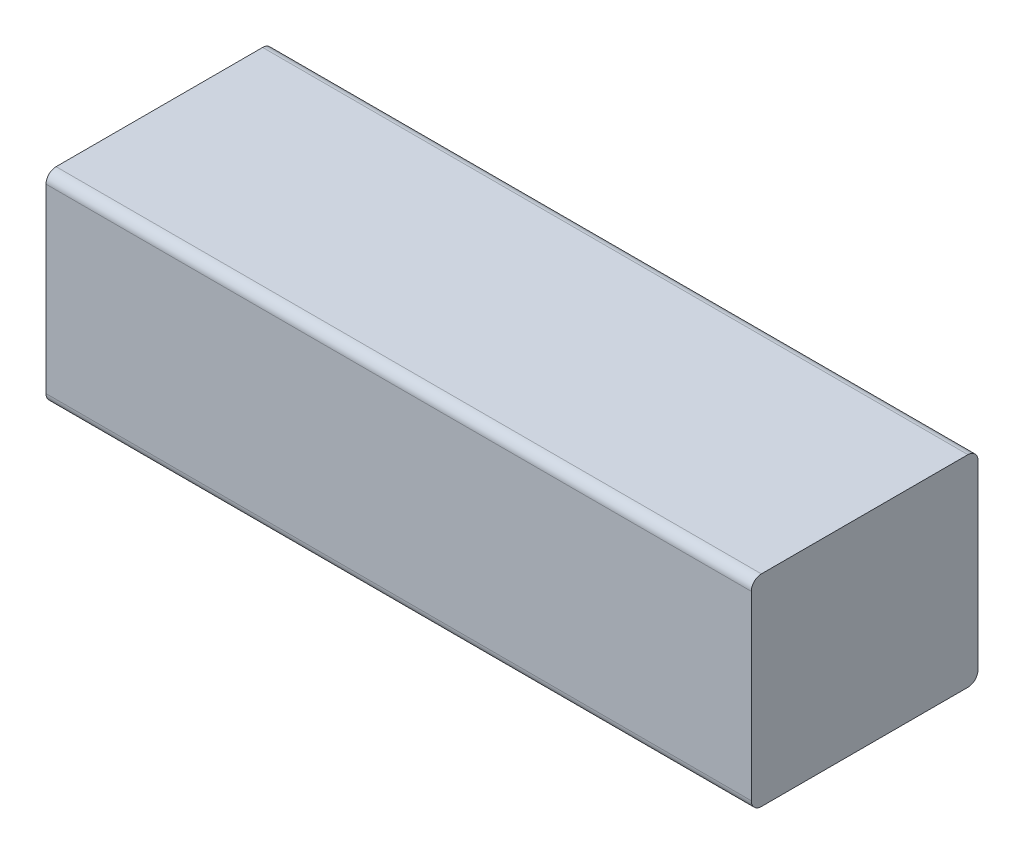
ISO-10303-21;
HEADER;
FILE_DESCRIPTION(('STEP AP214'),'2;1');
FILE_NAME('part.step','',(''),(''),'','','');
FILE_SCHEMA(('AUTOMOTIVE_DESIGN { 1 0 10303 214 1 1 1 1 }'));
ENDSEC;
DATA;
#1=APPLICATION_CONTEXT('core data for automotive mechanical design processes');
#2=APPLICATION_PROTOCOL_DEFINITION('international standard','automotive_design',2000,#1);
#3=PRODUCT_CONTEXT('',#1,'mechanical');
#4=PRODUCT('Part','Part','',(#3));
#5=PRODUCT_RELATED_PRODUCT_CATEGORY('part','',(#4));
#6=PRODUCT_DEFINITION_FORMATION('','',#4);
#7=PRODUCT_DEFINITION_CONTEXT('part definition',#1,'design');
#8=PRODUCT_DEFINITION('design','',#6,#7);
#9=PRODUCT_DEFINITION_SHAPE('','',#8);
#10=(LENGTH_UNIT() NAMED_UNIT(*) SI_UNIT(.MILLI.,.METRE.));
#11=(NAMED_UNIT(*) PLANE_ANGLE_UNIT() SI_UNIT($,.RADIAN.));
#12=(NAMED_UNIT(*) SI_UNIT($,.STERADIAN.) SOLID_ANGLE_UNIT());
#13=UNCERTAINTY_MEASURE_WITH_UNIT(LENGTH_MEASURE(1.E-05),#10,'distance_accuracy_value','');
#14=(GEOMETRIC_REPRESENTATION_CONTEXT(3) GLOBAL_UNCERTAINTY_ASSIGNED_CONTEXT((#13)) GLOBAL_UNIT_ASSIGNED_CONTEXT((#10,
#11,#12)) REPRESENTATION_CONTEXT('',''));
#15=CARTESIAN_POINT('',(0.,0.,0.));
#16=DIRECTION('',(0.,0.,1.));
#17=DIRECTION('',(1.,0.,0.));
#18=AXIS2_PLACEMENT_3D('',#15,#16,#17);
#19=CARTESIAN_POINT('',(0.,40.,-45.));
#20=DIRECTION('',(1.,0.,0.));
#21=DIRECTION('',(0.,0.,-1.));
#22=AXIS2_PLACEMENT_3D('',#19,#20,#21);
#23=PLANE('',#22);
#24=DIRECTION('',(0.,-1.,0.));
#25=VECTOR('',#24,1.);
#26=CARTESIAN_POINT('',(0.,40.,-45.));
#27=LINE('',#26,#25);
#28=CARTESIAN_POINT('',(0.,38.,-45.));
#29=VERTEX_POINT('',#28);
#30=CARTESIAN_POINT('',(0.,2.,-45.));
#31=VERTEX_POINT('',#30);
#32=EDGE_CURVE('E106',#29,#31,#27,.T.);
#33=ORIENTED_EDGE('',*,*,#32,.T.);
#34=CARTESIAN_POINT('',(0.,2.,-43.));
#35=DIRECTION('',(1.,0.,0.));
#36=DIRECTION('',(0.,0.,-1.));
#37=AXIS2_PLACEMENT_3D('',#34,#35,#36);
#38=CIRCLE('',#37,2.);
#39=CARTESIAN_POINT('',(0.,0.,-43.));
#40=VERTEX_POINT('',#39);
#41=EDGE_CURVE('E139',#31,#40,#38,.F.);
#42=ORIENTED_EDGE('',*,*,#41,.T.);
#43=DIRECTION('',(0.,0.,1.));
#44=VECTOR('',#43,1.);
#45=CARTESIAN_POINT('',(0.,0.,-45.));
#46=LINE('',#45,#44);
#47=CARTESIAN_POINT('',(0.,0.,-2.00000000000002));
#48=VERTEX_POINT('',#47);
#49=EDGE_CURVE('E166',#40,#48,#46,.T.);
#50=ORIENTED_EDGE('',*,*,#49,.T.);
#51=CARTESIAN_POINT('',(0.,2.,-2.));
#52=DIRECTION('',(1.,0.,0.));
#53=DIRECTION('',(0.,0.,-1.));
#54=AXIS2_PLACEMENT_3D('',#51,#52,#53);
#55=CIRCLE('',#54,2.);
#56=CARTESIAN_POINT('',(0.,2.,0.));
#57=VERTEX_POINT('',#56);
#58=EDGE_CURVE('E112',#48,#57,#55,.F.);
#59=ORIENTED_EDGE('',*,*,#58,.T.);
#60=DIRECTION('',(0.,-1.,0.));
#61=VECTOR('',#60,1.);
#62=CARTESIAN_POINT('',(0.,40.,0.));
#63=LINE('',#62,#61);
#64=CARTESIAN_POINT('',(0.,38.,0.));
#65=VERTEX_POINT('',#64);
#66=EDGE_CURVE('E129',#65,#57,#63,.T.);
#67=ORIENTED_EDGE('',*,*,#66,.F.);
#68=CARTESIAN_POINT('',(0.,38.,-2.));
#69=DIRECTION('',(1.,0.,0.));
#70=DIRECTION('',(0.,0.,-1.));
#71=AXIS2_PLACEMENT_3D('',#68,#69,#70);
#72=CIRCLE('',#71,2.);
#73=CARTESIAN_POINT('',(0.,40.,-2.00000000000002));
#74=VERTEX_POINT('',#73);
#75=EDGE_CURVE('E113',#65,#74,#72,.F.);
#76=ORIENTED_EDGE('',*,*,#75,.T.);
#77=DIRECTION('',(0.,0.,1.));
#78=VECTOR('',#77,1.);
#79=CARTESIAN_POINT('',(0.,40.,-45.));
#80=LINE('',#79,#78);
#81=CARTESIAN_POINT('',(0.,40.,-43.));
#82=VERTEX_POINT('',#81);
#83=EDGE_CURVE('E108',#82,#74,#80,.T.);
#84=ORIENTED_EDGE('',*,*,#83,.F.);
#85=CARTESIAN_POINT('',(0.,38.,-43.));
#86=DIRECTION('',(1.,0.,0.));
#87=DIRECTION('',(0.,0.,-1.));
#88=AXIS2_PLACEMENT_3D('',#85,#86,#87);
#89=CIRCLE('',#88,2.);
#90=EDGE_CURVE('E104',#82,#29,#89,.F.);
#91=ORIENTED_EDGE('',*,*,#90,.T.);
#92=EDGE_LOOP('',(#33,#42,#50,#59,#67,#76,#84,#91));
#93=FACE_BOUND('',#92,.T.);
#94=ADVANCED_FACE('F37',(#93),#23,.F.);
#95=CARTESIAN_POINT('',(0.,40.,0.));
#96=DIRECTION('',(0.,0.,-1.));
#97=DIRECTION('',(-1.,0.,0.));
#98=AXIS2_PLACEMENT_3D('',#95,#96,#97);
#99=PLANE('',#98);
#100=ORIENTED_EDGE('',*,*,#66,.T.);
#101=DIRECTION('',(1.,0.,0.));
#102=VECTOR('',#101,1.);
#103=CARTESIAN_POINT('',(0.,2.,0.));
#104=LINE('',#103,#102);
#105=CARTESIAN_POINT('',(140.,2.,0.));
#106=VERTEX_POINT('',#105);
#107=EDGE_CURVE('E152',#57,#106,#104,.T.);
#108=ORIENTED_EDGE('',*,*,#107,.T.);
#109=DIRECTION('',(0.,-1.,0.));
#110=VECTOR('',#109,1.);
#111=CARTESIAN_POINT('',(140.,40.,0.));
#112=LINE('',#111,#110);
#113=CARTESIAN_POINT('',(140.,38.,0.));
#114=VERTEX_POINT('',#113);
#115=EDGE_CURVE('E133',#114,#106,#112,.T.);
#116=ORIENTED_EDGE('',*,*,#115,.F.);
#117=DIRECTION('',(1.,0.,0.));
#118=VECTOR('',#117,1.);
#119=CARTESIAN_POINT('',(0.,38.,0.));
#120=LINE('',#119,#118);
#121=EDGE_CURVE('E150',#114,#65,#120,.F.);
#122=ORIENTED_EDGE('',*,*,#121,.T.);
#123=EDGE_LOOP('',(#100,#108,#116,#122));
#124=FACE_BOUND('',#123,.T.);
#125=ADVANCED_FACE('F173',(#124),#99,.F.);
#126=CARTESIAN_POINT('',(140.,40.,0.));
#127=DIRECTION('',(-1.,0.,0.));
#128=DIRECTION('',(0.,0.,1.));
#129=AXIS2_PLACEMENT_3D('',#126,#127,#128);
#130=PLANE('',#129);
#131=DIRECTION('',(0.,0.,-1.));
#132=VECTOR('',#131,1.);
#133=CARTESIAN_POINT('',(140.,0.,0.));
#134=LINE('',#133,#132);
#135=CARTESIAN_POINT('',(140.,0.,-2.));
#136=VERTEX_POINT('',#135);
#137=CARTESIAN_POINT('',(140.,0.,-43.));
#138=VERTEX_POINT('',#137);
#139=EDGE_CURVE('E163',#136,#138,#134,.T.);
#140=ORIENTED_EDGE('',*,*,#139,.T.);
#141=CARTESIAN_POINT('',(140.,2.,-43.));
#142=DIRECTION('',(-1.,0.,0.));
#143=DIRECTION('',(0.,0.,1.));
#144=AXIS2_PLACEMENT_3D('',#141,#142,#143);
#145=CIRCLE('',#144,2.);
#146=CARTESIAN_POINT('',(140.,2.,-45.));
#147=VERTEX_POINT('',#146);
#148=EDGE_CURVE('E148',#138,#147,#145,.F.);
#149=ORIENTED_EDGE('',*,*,#148,.T.);
#150=DIRECTION('',(0.,-1.,0.));
#151=VECTOR('',#150,1.);
#152=CARTESIAN_POINT('',(140.,40.,-45.));
#153=LINE('',#152,#151);
#154=CARTESIAN_POINT('',(140.,38.,-45.));
#155=VERTEX_POINT('',#154);
#156=EDGE_CURVE('E123',#155,#147,#153,.T.);
#157=ORIENTED_EDGE('',*,*,#156,.F.);
#158=CARTESIAN_POINT('',(140.,38.,-43.));
#159=DIRECTION('',(-1.,0.,0.));
#160=DIRECTION('',(0.,0.,1.));
#161=AXIS2_PLACEMENT_3D('',#158,#159,#160);
#162=CIRCLE('',#161,2.);
#163=CARTESIAN_POINT('',(140.,40.,-43.));
#164=VERTEX_POINT('',#163);
#165=EDGE_CURVE('E128',#155,#164,#162,.F.);
#166=ORIENTED_EDGE('',*,*,#165,.T.);
#167=DIRECTION('',(0.,0.,-1.));
#168=VECTOR('',#167,1.);
#169=CARTESIAN_POINT('',(140.,40.,0.));
#170=LINE('',#169,#168);
#171=CARTESIAN_POINT('',(140.,40.,-2.));
#172=VERTEX_POINT('',#171);
#173=EDGE_CURVE('E124',#172,#164,#170,.T.);
#174=ORIENTED_EDGE('',*,*,#173,.F.);
#175=CARTESIAN_POINT('',(140.,38.,-2.));
#176=DIRECTION('',(-1.,0.,0.));
#177=DIRECTION('',(0.,0.,1.));
#178=AXIS2_PLACEMENT_3D('',#175,#176,#177);
#179=CIRCLE('',#178,2.);
#180=EDGE_CURVE('E60',#172,#114,#179,.F.);
#181=ORIENTED_EDGE('',*,*,#180,.T.);
#182=ORIENTED_EDGE('',*,*,#115,.T.);
#183=CARTESIAN_POINT('',(140.,2.,-2.));
#184=DIRECTION('',(-1.,0.,0.));
#185=DIRECTION('',(0.,0.,1.));
#186=AXIS2_PLACEMENT_3D('',#183,#184,#185);
#187=CIRCLE('',#186,2.);
#188=EDGE_CURVE('E52',#106,#136,#187,.F.);
#189=ORIENTED_EDGE('',*,*,#188,.T.);
#190=EDGE_LOOP('',(#140,#149,#157,#166,#174,#181,#182,#189));
#191=FACE_BOUND('',#190,.T.);
#192=ADVANCED_FACE('F161',(#191),#130,.F.);
#193=CARTESIAN_POINT('',(140.,40.,-45.));
#194=DIRECTION('',(0.,0.,1.));
#195=DIRECTION('',(1.,0.,0.));
#196=AXIS2_PLACEMENT_3D('',#193,#194,#195);
#197=PLANE('',#196);
#198=ORIENTED_EDGE('',*,*,#156,.T.);
#199=DIRECTION('',(-1.,0.,0.));
#200=VECTOR('',#199,1.);
#201=CARTESIAN_POINT('',(140.,2.,-45.));
#202=LINE('',#201,#200);
#203=EDGE_CURVE('E122',#147,#31,#202,.T.);
#204=ORIENTED_EDGE('',*,*,#203,.T.);
#205=ORIENTED_EDGE('',*,*,#32,.F.);
#206=DIRECTION('',(-1.,0.,0.));
#207=VECTOR('',#206,1.);
#208=CARTESIAN_POINT('',(140.,38.,-45.));
#209=LINE('',#208,#207);
#210=EDGE_CURVE('E119',#29,#155,#209,.F.);
#211=ORIENTED_EDGE('',*,*,#210,.T.);
#212=EDGE_LOOP('',(#198,#204,#205,#211));
#213=FACE_BOUND('',#212,.T.);
#214=ADVANCED_FACE('F118',(#213),#197,.F.);
#215=CARTESIAN_POINT('',(0.,40.,0.));
#216=DIRECTION('',(0.,1.,0.));
#217=DIRECTION('',(0.,0.,1.));
#218=AXIS2_PLACEMENT_3D('',#215,#216,#217);
#219=PLANE('',#218);
#220=ORIENTED_EDGE('',*,*,#173,.T.);
#221=DIRECTION('',(-1.,0.,0.));
#222=VECTOR('',#221,1.);
#223=CARTESIAN_POINT('',(0.,40.,-43.));
#224=LINE('',#223,#222);
#225=EDGE_CURVE('E11',#164,#82,#224,.T.);
#226=ORIENTED_EDGE('',*,*,#225,.T.);
#227=ORIENTED_EDGE('',*,*,#83,.T.);
#228=DIRECTION('',(1.,0.,0.));
#229=VECTOR('',#228,1.);
#230=CARTESIAN_POINT('',(140.,40.,-2.));
#231=LINE('',#230,#229);
#232=EDGE_CURVE('E45',#74,#172,#231,.T.);
#233=ORIENTED_EDGE('',*,*,#232,.T.);
#234=EDGE_LOOP('',(#220,#226,#227,#233));
#235=FACE_BOUND('',#234,.T.);
#236=ADVANCED_FACE('F157',(#235),#219,.T.);
#237=CARTESIAN_POINT('',(0.,0.,0.));
#238=DIRECTION('',(0.,1.,0.));
#239=DIRECTION('',(0.,0.,1.));
#240=AXIS2_PLACEMENT_3D('',#237,#238,#239);
#241=PLANE('',#240);
#242=ORIENTED_EDGE('',*,*,#49,.F.);
#243=DIRECTION('',(-1.,0.,0.));
#244=VECTOR('',#243,1.);
#245=CARTESIAN_POINT('',(0.,0.,-43.));
#246=LINE('',#245,#244);
#247=EDGE_CURVE('E143',#40,#138,#246,.F.);
#248=ORIENTED_EDGE('',*,*,#247,.T.);
#249=ORIENTED_EDGE('',*,*,#139,.F.);
#250=DIRECTION('',(1.,0.,0.));
#251=VECTOR('',#250,1.);
#252=CARTESIAN_POINT('',(0.,0.,-2.));
#253=LINE('',#252,#251);
#254=EDGE_CURVE('E141',#136,#48,#253,.F.);
#255=ORIENTED_EDGE('',*,*,#254,.T.);
#256=EDGE_LOOP('',(#242,#248,#249,#255));
#257=FACE_BOUND('',#256,.T.);
#258=ADVANCED_FACE('F179',(#257),#241,.F.);
#259=CARTESIAN_POINT('',(140.,2.,-43.));
#260=DIRECTION('',(-1.,0.,0.));
#261=DIRECTION('',(0.,0.,1.));
#262=AXIS2_PLACEMENT_3D('',#259,#260,#261);
#263=CYLINDRICAL_SURFACE('',#262,2.);
#264=ORIENTED_EDGE('',*,*,#148,.F.);
#265=ORIENTED_EDGE('',*,*,#247,.F.);
#266=ORIENTED_EDGE('',*,*,#41,.F.);
#267=ORIENTED_EDGE('',*,*,#203,.F.);
#268=EDGE_LOOP('',(#264,#265,#266,#267));
#269=FACE_BOUND('',#268,.T.);
#270=ADVANCED_FACE('F183',(#269),#263,.T.);
#271=CARTESIAN_POINT('',(0.,2.,-2.));
#272=DIRECTION('',(1.,0.,0.));
#273=DIRECTION('',(0.,0.,-1.));
#274=AXIS2_PLACEMENT_3D('',#271,#272,#273);
#275=CYLINDRICAL_SURFACE('',#274,2.);
#276=ORIENTED_EDGE('',*,*,#58,.F.);
#277=ORIENTED_EDGE('',*,*,#254,.F.);
#278=ORIENTED_EDGE('',*,*,#188,.F.);
#279=ORIENTED_EDGE('',*,*,#107,.F.);
#280=EDGE_LOOP('',(#276,#277,#278,#279));
#281=FACE_BOUND('',#280,.T.);
#282=ADVANCED_FACE('F176',(#281),#275,.T.);
#283=CARTESIAN_POINT('',(0.,38.,-43.));
#284=DIRECTION('',(1.,0.,0.));
#285=DIRECTION('',(0.,0.,-1.));
#286=AXIS2_PLACEMENT_3D('',#283,#284,#285);
#287=CYLINDRICAL_SURFACE('',#286,2.);
#288=ORIENTED_EDGE('',*,*,#165,.F.);
#289=ORIENTED_EDGE('',*,*,#210,.F.);
#290=ORIENTED_EDGE('',*,*,#90,.F.);
#291=ORIENTED_EDGE('',*,*,#225,.F.);
#292=EDGE_LOOP('',(#288,#289,#290,#291));
#293=FACE_BOUND('',#292,.T.);
#294=ADVANCED_FACE('F127',(#293),#287,.T.);
#295=CARTESIAN_POINT('',(0.,38.,-2.));
#296=DIRECTION('',(-1.,0.,0.));
#297=DIRECTION('',(0.,0.,1.));
#298=AXIS2_PLACEMENT_3D('',#295,#296,#297);
#299=CYLINDRICAL_SURFACE('',#298,2.);
#300=ORIENTED_EDGE('',*,*,#75,.F.);
#301=ORIENTED_EDGE('',*,*,#121,.F.);
#302=ORIENTED_EDGE('',*,*,#180,.F.);
#303=ORIENTED_EDGE('',*,*,#232,.F.);
#304=EDGE_LOOP('',(#300,#301,#302,#303));
#305=FACE_BOUND('',#304,.T.);
#306=ADVANCED_FACE('F39',(#305),#299,.T.);
#307=CLOSED_SHELL('',(#94,#125,#192,#214,#236,#258,#270,#282,#294,#306));
#308=MANIFOLD_SOLID_BREP('B2',#307);
#309=ADVANCED_BREP_SHAPE_REPRESENTATION('',(#18,#308),#14);
#310=SHAPE_DEFINITION_REPRESENTATION(#9,#309);
ENDSEC;
END-ISO-10303-21;
